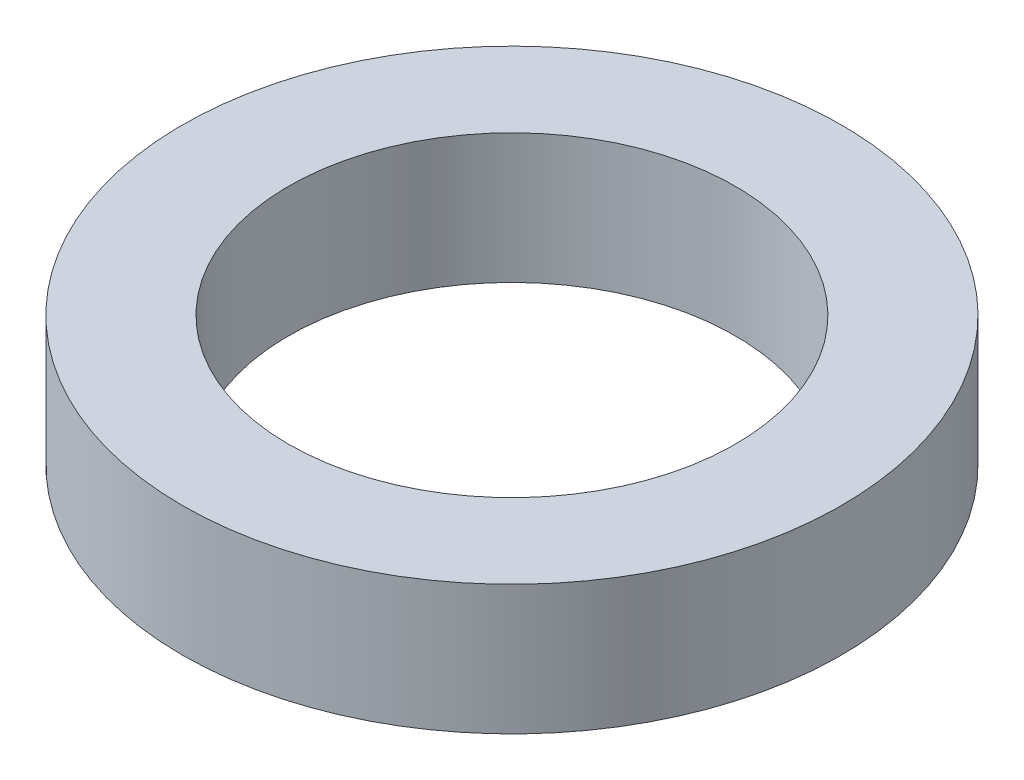
ISO-10303-21;
HEADER;
FILE_DESCRIPTION(('STEP AP214'),'2;1');
FILE_NAME('part.step','',(''),(''),'','','');
FILE_SCHEMA(('AUTOMOTIVE_DESIGN { 1 0 10303 214 1 1 1 1 }'));
ENDSEC;
DATA;
#1=APPLICATION_CONTEXT('core data for automotive mechanical design processes');
#2=APPLICATION_PROTOCOL_DEFINITION('international standard','automotive_design',2000,#1);
#3=PRODUCT_CONTEXT('',#1,'mechanical');
#4=PRODUCT('Part','Part','',(#3));
#5=PRODUCT_RELATED_PRODUCT_CATEGORY('part','',(#4));
#6=PRODUCT_DEFINITION_FORMATION('','',#4);
#7=PRODUCT_DEFINITION_CONTEXT('part definition',#1,'design');
#8=PRODUCT_DEFINITION('design','',#6,#7);
#9=PRODUCT_DEFINITION_SHAPE('','',#8);
#10=(LENGTH_UNIT() NAMED_UNIT(*) SI_UNIT(.MILLI.,.METRE.));
#11=(NAMED_UNIT(*) PLANE_ANGLE_UNIT() SI_UNIT($,.RADIAN.));
#12=(NAMED_UNIT(*) SI_UNIT($,.STERADIAN.) SOLID_ANGLE_UNIT());
#13=UNCERTAINTY_MEASURE_WITH_UNIT(LENGTH_MEASURE(1.E-05),#10,'distance_accuracy_value','');
#14=(GEOMETRIC_REPRESENTATION_CONTEXT(3) GLOBAL_UNCERTAINTY_ASSIGNED_CONTEXT((#13)) GLOBAL_UNIT_ASSIGNED_CONTEXT((#10,
#11,#12)) REPRESENTATION_CONTEXT('',''));
#15=CARTESIAN_POINT('',(0.,0.,0.));
#16=DIRECTION('',(0.,0.,1.));
#17=DIRECTION('',(1.,0.,0.));
#18=AXIS2_PLACEMENT_3D('',#15,#16,#17);
#19=CARTESIAN_POINT('',(0.,2.9464,0.));
#20=DIRECTION('',(0.,1.,0.));
#21=DIRECTION('',(0.,0.,1.));
#22=AXIS2_PLACEMENT_3D('',#19,#20,#21);
#23=PLANE('',#22);
#24=CARTESIAN_POINT('',(0.,2.9464,0.));
#25=DIRECTION('',(0.,1.,0.));
#26=DIRECTION('',(0.,0.,1.));
#27=AXIS2_PLACEMENT_3D('',#24,#25,#26);
#28=CIRCLE('',#27,7.493);
#29=CARTESIAN_POINT('',(0.,2.9464,7.493));
#30=VERTEX_POINT('',#29);
#31=EDGE_CURVE('E10',#30,#30,#28,.T.);
#32=ORIENTED_EDGE('',*,*,#31,.T.);
#33=EDGE_LOOP('',(#32));
#34=FACE_BOUND('',#33,.T.);
#35=CARTESIAN_POINT('',(0.,2.9464,0.));
#36=DIRECTION('',(0.,1.,0.));
#37=DIRECTION('',(0.,0.,1.));
#38=AXIS2_PLACEMENT_3D('',#35,#36,#37);
#39=CIRCLE('',#38,5.08);
#40=CARTESIAN_POINT('',(0.,2.9464,5.08));
#41=VERTEX_POINT('',#40);
#42=EDGE_CURVE('E50',#41,#41,#39,.T.);
#43=ORIENTED_EDGE('',*,*,#42,.F.);
#44=EDGE_LOOP('',(#43));
#45=FACE_BOUND('',#44,.T.);
#46=ADVANCED_FACE('F37',(#34,#45),#23,.T.);
#47=CARTESIAN_POINT('',(0.,0.,0.));
#48=DIRECTION('',(0.,1.,0.));
#49=DIRECTION('',(0.,0.,1.));
#50=AXIS2_PLACEMENT_3D('',#47,#48,#49);
#51=PLANE('',#50);
#52=CARTESIAN_POINT('',(0.,0.,0.));
#53=DIRECTION('',(0.,1.,0.));
#54=DIRECTION('',(0.,0.,1.));
#55=AXIS2_PLACEMENT_3D('',#52,#53,#54);
#56=CIRCLE('',#55,7.493);
#57=CARTESIAN_POINT('',(0.,0.,7.493));
#58=VERTEX_POINT('',#57);
#59=EDGE_CURVE('E41',#58,#58,#56,.T.);
#60=ORIENTED_EDGE('',*,*,#59,.F.);
#61=EDGE_LOOP('',(#60));
#62=FACE_BOUND('',#61,.T.);
#63=CARTESIAN_POINT('',(0.,0.,0.));
#64=DIRECTION('',(0.,1.,0.));
#65=DIRECTION('',(0.,0.,1.));
#66=AXIS2_PLACEMENT_3D('',#63,#64,#65);
#67=CIRCLE('',#66,5.08);
#68=CARTESIAN_POINT('',(0.,0.,5.08));
#69=VERTEX_POINT('',#68);
#70=EDGE_CURVE('E52',#69,#69,#67,.T.);
#71=ORIENTED_EDGE('',*,*,#70,.T.);
#72=EDGE_LOOP('',(#71));
#73=FACE_BOUND('',#72,.T.);
#74=ADVANCED_FACE('F64',(#62,#73),#51,.F.);
#75=CARTESIAN_POINT('',(0.,2.9464,0.));
#76=DIRECTION('',(0.,-1.,0.));
#77=DIRECTION('',(0.,0.,-1.));
#78=AXIS2_PLACEMENT_3D('',#75,#76,#77);
#79=CYLINDRICAL_SURFACE('',#78,7.493);
#80=ORIENTED_EDGE('',*,*,#31,.F.);
#81=EDGE_LOOP('',(#80));
#82=FACE_BOUND('',#81,.T.);
#83=ORIENTED_EDGE('',*,*,#59,.T.);
#84=EDGE_LOOP('',(#83));
#85=FACE_BOUND('',#84,.T.);
#86=ADVANCED_FACE('F39',(#82,#85),#79,.T.);
#87=CARTESIAN_POINT('',(0.,2.9464,0.));
#88=DIRECTION('',(0.,-1.,0.));
#89=DIRECTION('',(0.,0.,-1.));
#90=AXIS2_PLACEMENT_3D('',#87,#88,#89);
#91=CYLINDRICAL_SURFACE('',#90,5.08);
#92=ORIENTED_EDGE('',*,*,#42,.T.);
#93=EDGE_LOOP('',(#92));
#94=FACE_BOUND('',#93,.T.);
#95=ORIENTED_EDGE('',*,*,#70,.F.);
#96=EDGE_LOOP('',(#95));
#97=FACE_BOUND('',#96,.T.);
#98=ADVANCED_FACE('F60',(#94,#97),#91,.F.);
#99=CLOSED_SHELL('',(#46,#74,#86,#98));
#100=MANIFOLD_SOLID_BREP('B2',#99);
#101=ADVANCED_BREP_SHAPE_REPRESENTATION('',(#18,#100),#14);
#102=SHAPE_DEFINITION_REPRESENTATION(#9,#101);
ENDSEC;
END-ISO-10303-21;
